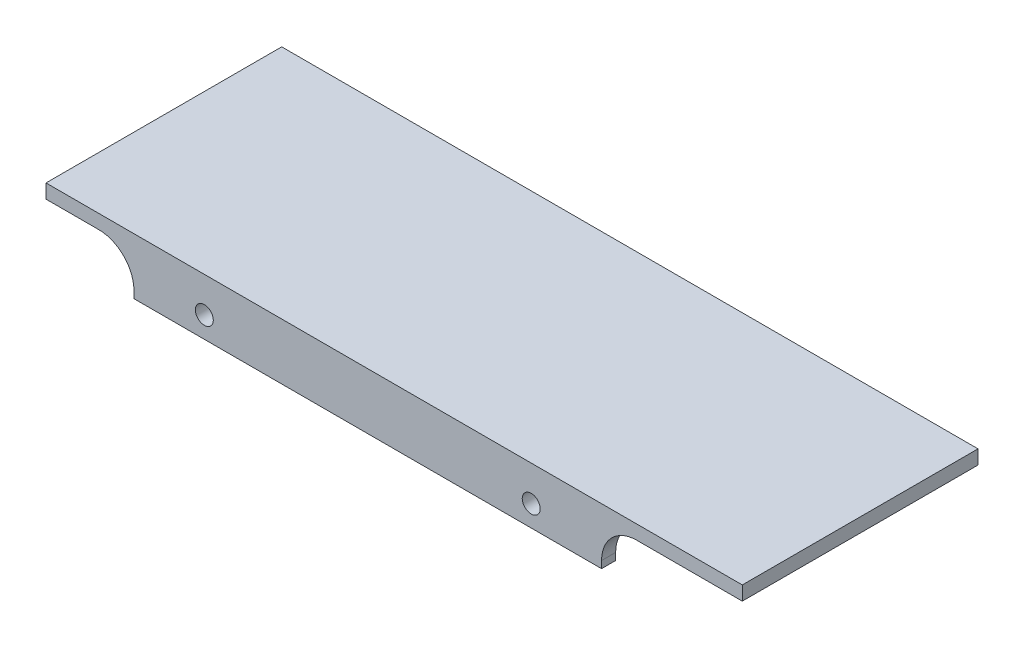
ISO-10303-21;
HEADER;
FILE_DESCRIPTION(('STEP AP214'),'2;1');
FILE_NAME('part.step','',(''),(''),'','','');
FILE_SCHEMA(('AUTOMOTIVE_DESIGN { 1 0 10303 214 1 1 1 1 }'));
ENDSEC;
DATA;
#1=APPLICATION_CONTEXT('core data for automotive mechanical design processes');
#2=APPLICATION_PROTOCOL_DEFINITION('international standard','automotive_design',2000,#1);
#3=PRODUCT_CONTEXT('',#1,'mechanical');
#4=PRODUCT('Part','Part','',(#3));
#5=PRODUCT_RELATED_PRODUCT_CATEGORY('part','',(#4));
#6=PRODUCT_DEFINITION_FORMATION('','',#4);
#7=PRODUCT_DEFINITION_CONTEXT('part definition',#1,'design');
#8=PRODUCT_DEFINITION('design','',#6,#7);
#9=PRODUCT_DEFINITION_SHAPE('','',#8);
#10=(LENGTH_UNIT() NAMED_UNIT(*) SI_UNIT(.MILLI.,.METRE.));
#11=(NAMED_UNIT(*) PLANE_ANGLE_UNIT() SI_UNIT($,.RADIAN.));
#12=(NAMED_UNIT(*) SI_UNIT($,.STERADIAN.) SOLID_ANGLE_UNIT());
#13=UNCERTAINTY_MEASURE_WITH_UNIT(LENGTH_MEASURE(1.E-05),#10,'distance_accuracy_value','');
#14=(GEOMETRIC_REPRESENTATION_CONTEXT(3) GLOBAL_UNCERTAINTY_ASSIGNED_CONTEXT((#13)) GLOBAL_UNIT_ASSIGNED_CONTEXT((#10,
#11,#12)) REPRESENTATION_CONTEXT('',''));
#15=CARTESIAN_POINT('',(0.,0.,0.));
#16=DIRECTION('',(0.,0.,1.));
#17=DIRECTION('',(1.,0.,0.));
#18=AXIS2_PLACEMENT_3D('',#15,#16,#17);
#19=CARTESIAN_POINT('',(-1.60418411700392E-13,55.7999999999995,0.));
#20=DIRECTION('',(0.,1.,0.));
#21=DIRECTION('',(-1.,0.,0.));
#22=AXIS2_PLACEMENT_3D('',#19,#20,#21);
#23=PLANE('',#22);
#24=DIRECTION('',(0.,0.,1.));
#25=VECTOR('',#24,1.);
#26=CARTESIAN_POINT('',(-40.,55.7999999999994,62.9999999999997));
#27=LINE('',#26,#25);
#28=CARTESIAN_POINT('',(-40.,55.7999999999994,66.9999999999997));
#29=VERTEX_POINT('',#28);
#30=CARTESIAN_POINT('',(-40.,55.7999999999994,60.4999999999997));
#31=VERTEX_POINT('',#30);
#32=EDGE_CURVE('E274',#29,#31,#27,.F.);
#33=ORIENTED_EDGE('',*,*,#32,.T.);
#34=DIRECTION('',(1.,0.,0.));
#35=VECTOR('',#34,1.);
#36=CARTESIAN_POINT('',(-1.60418411700392E-13,55.7999999999995,60.4999999999997));
#37=LINE('',#36,#35);
#38=CARTESIAN_POINT('',(-192.917449812531,55.7999999999989,60.4999999999997));
#39=VERTEX_POINT('',#38);
#40=EDGE_CURVE('E310',#31,#39,#37,.F.);
#41=ORIENTED_EDGE('',*,*,#40,.T.);
#42=DIRECTION('',(0.,0.,1.));
#43=VECTOR('',#42,1.);
#44=CARTESIAN_POINT('',(-192.917449812531,55.7999999999989,66.9999999999997));
#45=LINE('',#44,#43);
#46=CARTESIAN_POINT('',(-192.917449812531,55.7999999999989,66.9999999999997));
#47=VERTEX_POINT('',#46);
#48=EDGE_CURVE('E279',#39,#47,#45,.T.);
#49=ORIENTED_EDGE('',*,*,#48,.T.);
#50=DIRECTION('',(1.,0.,0.));
#51=VECTOR('',#50,1.);
#52=CARTESIAN_POINT('',(-207.917449812527,55.7999999999989,66.9999999999997));
#53=LINE('',#52,#51);
#54=CARTESIAN_POINT('',(-207.917449812527,55.7999999999989,66.9999999999997));
#55=VERTEX_POINT('',#54);
#56=EDGE_CURVE('E220',#55,#47,#53,.T.);
#57=ORIENTED_EDGE('',*,*,#56,.F.);
#58=DIRECTION('',(0.,0.,1.));
#59=VECTOR('',#58,1.);
#60=CARTESIAN_POINT('',(-207.917449812527,55.7999999999989,0.));
#61=LINE('',#60,#59);
#62=CARTESIAN_POINT('',(-207.917449812527,55.7999999999989,0.));
#63=VERTEX_POINT('',#62);
#64=EDGE_CURVE('E188',#63,#55,#61,.T.);
#65=ORIENTED_EDGE('',*,*,#64,.F.);
#66=DIRECTION('',(-1.,0.,0.));
#67=VECTOR('',#66,1.);
#68=CARTESIAN_POINT('',(-207.917449812527,55.7999999999989,0.));
#69=LINE('',#68,#67);
#70=CARTESIAN_POINT('',(-192.917449812531,55.7999999999989,0.));
#71=VERTEX_POINT('',#70);
#72=EDGE_CURVE('E225',#71,#63,#69,.T.);
#73=ORIENTED_EDGE('',*,*,#72,.F.);
#74=DIRECTION('',(0.,0.,-1.));
#75=VECTOR('',#74,1.);
#76=CARTESIAN_POINT('',(-192.917449812531,55.7999999999989,4.));
#77=LINE('',#76,#75);
#78=CARTESIAN_POINT('',(-192.917449812531,55.7999999999989,6.5));
#79=VERTEX_POINT('',#78);
#80=EDGE_CURVE('E282',#71,#79,#77,.F.);
#81=ORIENTED_EDGE('',*,*,#80,.T.);
#82=DIRECTION('',(-1.,0.,0.));
#83=VECTOR('',#82,1.);
#84=CARTESIAN_POINT('',(-1.60418411700392E-13,55.7999999999995,6.5));
#85=LINE('',#84,#83);
#86=CARTESIAN_POINT('',(-40.,55.7999999999994,6.5));
#87=VERTEX_POINT('',#86);
#88=EDGE_CURVE('E307',#79,#87,#85,.F.);
#89=ORIENTED_EDGE('',*,*,#88,.T.);
#90=DIRECTION('',(0.,0.,-1.));
#91=VECTOR('',#90,1.);
#92=CARTESIAN_POINT('',(-40.,55.7999999999994,0.));
#93=LINE('',#92,#91);
#94=CARTESIAN_POINT('',(-40.,55.7999999999994,0.));
#95=VERTEX_POINT('',#94);
#96=EDGE_CURVE('E276',#87,#95,#93,.T.);
#97=ORIENTED_EDGE('',*,*,#96,.T.);
#98=CARTESIAN_POINT('',(-9.99999999999982,55.7999999999995,0.));
#99=VERTEX_POINT('',#98);
#100=EDGE_CURVE('E210',#99,#95,#69,.T.);
#101=ORIENTED_EDGE('',*,*,#100,.F.);
#102=DIRECTION('',(0.,0.,-1.));
#103=VECTOR('',#102,1.);
#104=CARTESIAN_POINT('',(-9.99999999999982,55.7999999999995,0.));
#105=LINE('',#104,#103);
#106=CARTESIAN_POINT('',(-9.99999999999984,55.7999999999995,66.9999999999997));
#107=VERTEX_POINT('',#106);
#108=EDGE_CURVE('E223',#107,#99,#105,.T.);
#109=ORIENTED_EDGE('',*,*,#108,.F.);
#110=EDGE_CURVE('E219',#29,#107,#53,.T.);
#111=ORIENTED_EDGE('',*,*,#110,.F.);
#112=EDGE_LOOP('',(#33,#41,#49,#57,#65,#73,#81,#89,#97,#101,#109,#111));
#113=FACE_BOUND('',#112,.T.);
#114=ADVANCED_FACE('F34',(#113),#23,.F.);
#115=CARTESIAN_POINT('',(0.,0.,4.));
#116=DIRECTION('',(0.,0.,1.));
#117=DIRECTION('',(1.,0.,0.));
#118=AXIS2_PLACEMENT_3D('',#115,#116,#117);
#119=PLANE('',#118);
#120=CARTESIAN_POINT('',(-162.917449812531,49.7999999999995,4.));
#121=DIRECTION('',(0.,0.,1.));
#122=DIRECTION('',(1.,0.,0.));
#123=AXIS2_PLACEMENT_3D('',#120,#121,#122);
#124=CIRCLE('',#123,2.54999999999999);
#125=CARTESIAN_POINT('',(-160.367449812531,49.7999999999995,4.));
#126=VERTEX_POINT('',#125);
#127=EDGE_CURVE('E246',#126,#126,#124,.T.);
#128=ORIENTED_EDGE('',*,*,#127,.F.);
#129=EDGE_LOOP('',(#128));
#130=FACE_BOUND('',#129,.T.);
#131=CARTESIAN_POINT('',(-39.9999999999999,45.7999999999994,4.));
#132=DIRECTION('',(0.,0.,1.));
#133=DIRECTION('',(1.,0.,0.));
#134=AXIS2_PLACEMENT_3D('',#131,#132,#133);
#135=CIRCLE('',#134,10.);
#136=CARTESIAN_POINT('',(-49.9999999999999,45.7999999999994,4.));
#137=VERTEX_POINT('',#136);
#138=CARTESIAN_POINT('',(-46.6143782776614,53.2999999999994,4.));
#139=VERTEX_POINT('',#138);
#140=EDGE_CURVE('E300',#137,#139,#135,.F.);
#141=ORIENTED_EDGE('',*,*,#140,.T.);
#142=DIRECTION('',(-1.,0.,0.));
#143=VECTOR('',#142,1.);
#144=CARTESIAN_POINT('',(-1.53231206875105E-13,53.2999999999995,4.));
#145=LINE('',#144,#143);
#146=CARTESIAN_POINT('',(-186.303071534869,53.299999999999,4.));
#147=VERTEX_POINT('',#146);
#148=EDGE_CURVE('E313',#139,#147,#145,.T.);
#149=ORIENTED_EDGE('',*,*,#148,.T.);
#150=CARTESIAN_POINT('',(-192.917449812531,45.7999999999989,4.));
#151=DIRECTION('',(0.,0.,1.));
#152=DIRECTION('',(1.,0.,0.));
#153=AXIS2_PLACEMENT_3D('',#150,#151,#152);
#154=CIRCLE('',#153,10.);
#155=CARTESIAN_POINT('',(-182.917449812531,45.7999999999989,4.));
#156=VERTEX_POINT('',#155);
#157=EDGE_CURVE('E292',#147,#156,#154,.F.);
#158=ORIENTED_EDGE('',*,*,#157,.T.);
#159=DIRECTION('',(0.,-1.,0.));
#160=VECTOR('',#159,1.);
#161=CARTESIAN_POINT('',(-182.917449812531,55.7999999999995,4.));
#162=LINE('',#161,#160);
#163=CARTESIAN_POINT('',(-182.917449812531,43.7999999999995,4.));
#164=VERTEX_POINT('',#163);
#165=EDGE_CURVE('E252',#156,#164,#162,.T.);
#166=ORIENTED_EDGE('',*,*,#165,.T.);
#167=DIRECTION('',(1.,0.,0.));
#168=VECTOR('',#167,1.);
#169=CARTESIAN_POINT('',(-182.917449812531,43.7999999999995,4.));
#170=LINE('',#169,#168);
#171=CARTESIAN_POINT('',(-49.9999999999999,43.7999999999995,4.));
#172=VERTEX_POINT('',#171);
#173=EDGE_CURVE('E254',#164,#172,#170,.T.);
#174=ORIENTED_EDGE('',*,*,#173,.T.);
#175=DIRECTION('',(0.,1.,0.));
#176=VECTOR('',#175,1.);
#177=CARTESIAN_POINT('',(-49.9999999999999,55.7999999999995,4.));
#178=LINE('',#177,#176);
#179=EDGE_CURVE('E257',#172,#137,#178,.T.);
#180=ORIENTED_EDGE('',*,*,#179,.T.);
#181=EDGE_LOOP('',(#141,#149,#158,#166,#174,#180));
#182=FACE_BOUND('',#181,.T.);
#183=CARTESIAN_POINT('',(-69.9999999999999,49.7999999999995,4.));
#184=DIRECTION('',(0.,0.,1.));
#185=DIRECTION('',(1.,0.,0.));
#186=AXIS2_PLACEMENT_3D('',#183,#184,#185);
#187=CIRCLE('',#186,2.54999999999999);
#188=CARTESIAN_POINT('',(-67.4499999999999,49.7999999999995,4.));
#189=VERTEX_POINT('',#188);
#190=EDGE_CURVE('E240',#189,#189,#187,.T.);
#191=ORIENTED_EDGE('',*,*,#190,.F.);
#192=EDGE_LOOP('',(#191));
#193=FACE_BOUND('',#192,.T.);
#194=ADVANCED_FACE('F344',(#130,#182,#193),#119,.T.);
#195=CARTESIAN_POINT('',(0.,0.,0.));
#196=DIRECTION('',(0.,0.,1.));
#197=DIRECTION('',(1.,0.,0.));
#198=AXIS2_PLACEMENT_3D('',#195,#196,#197);
#199=PLANE('',#198);
#200=DIRECTION('',(0.,-1.,0.));
#201=VECTOR('',#200,1.);
#202=CARTESIAN_POINT('',(-182.917449812531,55.7999999999995,0.));
#203=LINE('',#202,#201);
#204=CARTESIAN_POINT('',(-182.917449812531,45.7999999999989,0.));
#205=VERTEX_POINT('',#204);
#206=CARTESIAN_POINT('',(-182.917449812531,43.7999999999995,0.));
#207=VERTEX_POINT('',#206);
#208=EDGE_CURVE('E249',#205,#207,#203,.T.);
#209=ORIENTED_EDGE('',*,*,#208,.F.);
#210=CARTESIAN_POINT('',(-192.917449812531,45.7999999999989,0.));
#211=DIRECTION('',(0.,0.,1.));
#212=DIRECTION('',(1.,0.,0.));
#213=AXIS2_PLACEMENT_3D('',#210,#211,#212);
#214=CIRCLE('',#213,10.);
#215=EDGE_CURVE('E290',#205,#71,#214,.T.);
#216=ORIENTED_EDGE('',*,*,#215,.T.);
#217=ORIENTED_EDGE('',*,*,#72,.T.);
#218=DIRECTION('',(0.,-1.,0.));
#219=VECTOR('',#218,1.);
#220=CARTESIAN_POINT('',(-207.917449812527,59.7999999999989,0.));
#221=LINE('',#220,#219);
#222=CARTESIAN_POINT('',(-207.917449812527,59.7999999999989,0.));
#223=VERTEX_POINT('',#222);
#224=EDGE_CURVE('E216',#223,#63,#221,.T.);
#225=ORIENTED_EDGE('',*,*,#224,.F.);
#226=DIRECTION('',(-1.,0.,0.));
#227=VECTOR('',#226,1.);
#228=CARTESIAN_POINT('',(-207.917449812527,59.7999999999989,0.));
#229=LINE('',#228,#227);
#230=CARTESIAN_POINT('',(-9.99999999999983,59.7999999999995,0.));
#231=VERTEX_POINT('',#230);
#232=EDGE_CURVE('E214',#231,#223,#229,.T.);
#233=ORIENTED_EDGE('',*,*,#232,.F.);
#234=DIRECTION('',(0.,-1.,0.));
#235=VECTOR('',#234,1.);
#236=CARTESIAN_POINT('',(-9.99999999999983,59.7999999999995,0.));
#237=LINE('',#236,#235);
#238=EDGE_CURVE('E230',#231,#99,#237,.T.);
#239=ORIENTED_EDGE('',*,*,#238,.T.);
#240=ORIENTED_EDGE('',*,*,#100,.T.);
#241=CARTESIAN_POINT('',(-39.9999999999999,45.7999999999994,0.));
#242=DIRECTION('',(0.,0.,1.));
#243=DIRECTION('',(1.,0.,0.));
#244=AXIS2_PLACEMENT_3D('',#241,#242,#243);
#245=CIRCLE('',#244,10.);
#246=CARTESIAN_POINT('',(-49.9999999999999,45.7999999999994,0.));
#247=VERTEX_POINT('',#246);
#248=EDGE_CURVE('E298',#95,#247,#245,.T.);
#249=ORIENTED_EDGE('',*,*,#248,.T.);
#250=DIRECTION('',(0.,1.,0.));
#251=VECTOR('',#250,1.);
#252=CARTESIAN_POINT('',(-49.9999999999999,55.7999999999995,0.));
#253=LINE('',#252,#251);
#254=CARTESIAN_POINT('',(-49.9999999999999,43.7999999999995,0.));
#255=VERTEX_POINT('',#254);
#256=EDGE_CURVE('E255',#255,#247,#253,.T.);
#257=ORIENTED_EDGE('',*,*,#256,.F.);
#258=DIRECTION('',(1.,0.,0.));
#259=VECTOR('',#258,1.);
#260=CARTESIAN_POINT('',(-182.917449812531,43.7999999999995,0.));
#261=LINE('',#260,#259);
#262=EDGE_CURVE('E262',#207,#255,#261,.T.);
#263=ORIENTED_EDGE('',*,*,#262,.F.);
#264=EDGE_LOOP('',(#209,#216,#217,#225,#233,#239,#240,#249,#257,#263));
#265=FACE_BOUND('',#264,.T.);
#266=CARTESIAN_POINT('',(-162.917449812531,49.7999999999995,0.));
#267=DIRECTION('',(0.,0.,1.));
#268=DIRECTION('',(1.,0.,0.));
#269=AXIS2_PLACEMENT_3D('',#266,#267,#268);
#270=CIRCLE('',#269,2.54999999999999);
#271=CARTESIAN_POINT('',(-160.367449812531,49.7999999999995,0.));
#272=VERTEX_POINT('',#271);
#273=EDGE_CURVE('E243',#272,#272,#270,.T.);
#274=ORIENTED_EDGE('',*,*,#273,.T.);
#275=EDGE_LOOP('',(#274));
#276=FACE_BOUND('',#275,.T.);
#277=CARTESIAN_POINT('',(-69.9999999999999,49.7999999999995,0.));
#278=DIRECTION('',(0.,0.,1.));
#279=DIRECTION('',(1.,0.,0.));
#280=AXIS2_PLACEMENT_3D('',#277,#278,#279);
#281=CIRCLE('',#280,2.54999999999999);
#282=CARTESIAN_POINT('',(-67.4499999999999,49.7999999999995,0.));
#283=VERTEX_POINT('',#282);
#284=EDGE_CURVE('E239',#283,#283,#281,.T.);
#285=ORIENTED_EDGE('',*,*,#284,.T.);
#286=EDGE_LOOP('',(#285));
#287=FACE_BOUND('',#286,.T.);
#288=ADVANCED_FACE('F350',(#265,#276,#287),#199,.F.);
#289=CARTESIAN_POINT('',(-182.917449812531,55.7999999999995,4.));
#290=DIRECTION('',(1.,0.,0.));
#291=DIRECTION('',(0.,0.,-1.));
#292=AXIS2_PLACEMENT_3D('',#289,#290,#291);
#293=PLANE('',#292);
#294=ORIENTED_EDGE('',*,*,#165,.F.);
#295=DIRECTION('',(0.,0.,-1.));
#296=VECTOR('',#295,1.);
#297=CARTESIAN_POINT('',(-182.917449812531,45.7999999999989,0.));
#298=LINE('',#297,#296);
#299=EDGE_CURVE('E271',#156,#205,#298,.T.);
#300=ORIENTED_EDGE('',*,*,#299,.T.);
#301=ORIENTED_EDGE('',*,*,#208,.T.);
#302=DIRECTION('',(0.,0.,-1.));
#303=VECTOR('',#302,1.);
#304=CARTESIAN_POINT('',(-182.917449812531,43.7999999999995,4.));
#305=LINE('',#304,#303);
#306=EDGE_CURVE('E268',#164,#207,#305,.T.);
#307=ORIENTED_EDGE('',*,*,#306,.F.);
#308=EDGE_LOOP('',(#294,#300,#301,#307));
#309=FACE_BOUND('',#308,.T.);
#310=ADVANCED_FACE('F380',(#309),#293,.F.);
#311=CARTESIAN_POINT('',(-182.917449812531,43.7999999999995,4.));
#312=DIRECTION('',(0.,1.,0.));
#313=DIRECTION('',(0.,0.,1.));
#314=AXIS2_PLACEMENT_3D('',#311,#312,#313);
#315=PLANE('',#314);
#316=ORIENTED_EDGE('',*,*,#262,.T.);
#317=DIRECTION('',(0.,0.,-1.));
#318=VECTOR('',#317,1.);
#319=CARTESIAN_POINT('',(-49.9999999999999,43.7999999999995,4.));
#320=LINE('',#319,#318);
#321=EDGE_CURVE('E260',#172,#255,#320,.T.);
#322=ORIENTED_EDGE('',*,*,#321,.F.);
#323=ORIENTED_EDGE('',*,*,#173,.F.);
#324=ORIENTED_EDGE('',*,*,#306,.T.);
#325=EDGE_LOOP('',(#316,#322,#323,#324));
#326=FACE_BOUND('',#325,.T.);
#327=ADVANCED_FACE('F384',(#326),#315,.F.);
#328=CARTESIAN_POINT('',(-49.9999999999999,55.7999999999995,4.));
#329=DIRECTION('',(-1.,0.,0.));
#330=DIRECTION('',(0.,0.,1.));
#331=AXIS2_PLACEMENT_3D('',#328,#329,#330);
#332=PLANE('',#331);
#333=ORIENTED_EDGE('',*,*,#256,.T.);
#334=DIRECTION('',(0.,0.,-1.));
#335=VECTOR('',#334,1.);
#336=CARTESIAN_POINT('',(-49.9999999999999,45.7999999999994,4.));
#337=LINE('',#336,#335);
#338=EDGE_CURVE('E286',#247,#137,#337,.F.);
#339=ORIENTED_EDGE('',*,*,#338,.T.);
#340=ORIENTED_EDGE('',*,*,#179,.F.);
#341=ORIENTED_EDGE('',*,*,#321,.T.);
#342=EDGE_LOOP('',(#333,#339,#340,#341));
#343=FACE_BOUND('',#342,.T.);
#344=ADVANCED_FACE('F375',(#343),#332,.F.);
#345=CARTESIAN_POINT('',(-162.917449812531,49.7999999999995,4.));
#346=DIRECTION('',(0.,0.,-1.));
#347=DIRECTION('',(-1.,0.,0.));
#348=AXIS2_PLACEMENT_3D('',#345,#346,#347);
#349=CYLINDRICAL_SURFACE('',#348,2.54999999999999);
#350=ORIENTED_EDGE('',*,*,#127,.T.);
#351=EDGE_LOOP('',(#350));
#352=FACE_BOUND('',#351,.T.);
#353=ORIENTED_EDGE('',*,*,#273,.F.);
#354=EDGE_LOOP('',(#353));
#355=FACE_BOUND('',#354,.T.);
#356=ADVANCED_FACE('F372',(#352,#355),#349,.F.);
#357=CARTESIAN_POINT('',(-69.9999999999999,49.7999999999995,4.));
#358=DIRECTION('',(0.,0.,-1.));
#359=DIRECTION('',(-1.,0.,0.));
#360=AXIS2_PLACEMENT_3D('',#357,#358,#359);
#361=CYLINDRICAL_SURFACE('',#360,2.54999999999999);
#362=ORIENTED_EDGE('',*,*,#190,.T.);
#363=EDGE_LOOP('',(#362));
#364=FACE_BOUND('',#363,.T.);
#365=ORIENTED_EDGE('',*,*,#284,.F.);
#366=EDGE_LOOP('',(#365));
#367=FACE_BOUND('',#366,.T.);
#368=ADVANCED_FACE('F368',(#364,#367),#361,.F.);
#369=CARTESIAN_POINT('',(-207.917449812527,59.7999999999989,0.));
#370=DIRECTION('',(1.,0.,0.));
#371=DIRECTION('',(0.,1.,0.));
#372=AXIS2_PLACEMENT_3D('',#369,#370,#371);
#373=PLANE('',#372);
#374=ORIENTED_EDGE('',*,*,#64,.T.);
#375=DIRECTION('',(0.,-1.,0.));
#376=VECTOR('',#375,1.);
#377=CARTESIAN_POINT('',(-207.917449812527,59.7999999999989,66.9999999999997));
#378=LINE('',#377,#376);
#379=CARTESIAN_POINT('',(-207.917449812527,59.7999999999989,66.9999999999997));
#380=VERTEX_POINT('',#379);
#381=EDGE_CURVE('E236',#380,#55,#378,.T.);
#382=ORIENTED_EDGE('',*,*,#381,.F.);
#383=DIRECTION('',(0.,0.,1.));
#384=VECTOR('',#383,1.);
#385=CARTESIAN_POINT('',(-207.917449812527,59.7999999999989,0.));
#386=LINE('',#385,#384);
#387=EDGE_CURVE('E206',#223,#380,#386,.T.);
#388=ORIENTED_EDGE('',*,*,#387,.F.);
#389=ORIENTED_EDGE('',*,*,#224,.T.);
#390=EDGE_LOOP('',(#374,#382,#388,#389));
#391=FACE_BOUND('',#390,.T.);
#392=ADVANCED_FACE('F364',(#391),#373,.F.);
#393=CARTESIAN_POINT('',(-207.917449812527,59.7999999999989,66.9999999999997));
#394=DIRECTION('',(0.,0.,-1.));
#395=DIRECTION('',(-1.,0.,0.));
#396=AXIS2_PLACEMENT_3D('',#393,#394,#395);
#397=PLANE('',#396);
#398=ORIENTED_EDGE('',*,*,#56,.T.);
#399=CARTESIAN_POINT('',(-192.917449812531,45.7999999999989,66.9999999999997));
#400=DIRECTION('',(0.,0.,-1.));
#401=DIRECTION('',(-1.,0.,0.));
#402=AXIS2_PLACEMENT_3D('',#399,#400,#401);
#403=CIRCLE('',#402,10.);
#404=CARTESIAN_POINT('',(-182.917449812531,45.7999999999989,66.9999999999997));
#405=VERTEX_POINT('',#404);
#406=EDGE_CURVE('E294',#47,#405,#403,.T.);
#407=ORIENTED_EDGE('',*,*,#406,.T.);
#408=DIRECTION('',(0.,1.,0.));
#409=VECTOR('',#408,1.);
#410=CARTESIAN_POINT('',(-182.917449812531,43.7999999999995,66.9999999999997));
#411=LINE('',#410,#409);
#412=CARTESIAN_POINT('',(-182.917449812531,43.7999999999995,66.9999999999997));
#413=VERTEX_POINT('',#412);
#414=EDGE_CURVE('E179',#413,#405,#411,.T.);
#415=ORIENTED_EDGE('',*,*,#414,.F.);
#416=DIRECTION('',(-1.,0.,0.));
#417=VECTOR('',#416,1.);
#418=CARTESIAN_POINT('',(-49.9999999999999,43.7999999999995,66.9999999999997));
#419=LINE('',#418,#417);
#420=CARTESIAN_POINT('',(-49.9999999999999,43.7999999999995,66.9999999999997));
#421=VERTEX_POINT('',#420);
#422=EDGE_CURVE('E200',#421,#413,#419,.T.);
#423=ORIENTED_EDGE('',*,*,#422,.F.);
#424=DIRECTION('',(0.,-1.,0.));
#425=VECTOR('',#424,1.);
#426=CARTESIAN_POINT('',(-49.9999999999999,55.7999999999995,66.9999999999997));
#427=LINE('',#426,#425);
#428=CARTESIAN_POINT('',(-49.9999999999999,45.7999999999994,66.9999999999997));
#429=VERTEX_POINT('',#428);
#430=EDGE_CURVE('E185',#429,#421,#427,.T.);
#431=ORIENTED_EDGE('',*,*,#430,.F.);
#432=CARTESIAN_POINT('',(-39.9999999999999,45.7999999999994,66.9999999999997));
#433=DIRECTION('',(0.,0.,-1.));
#434=DIRECTION('',(-1.,0.,0.));
#435=AXIS2_PLACEMENT_3D('',#432,#433,#434);
#436=CIRCLE('',#435,10.);
#437=EDGE_CURVE('E302',#429,#29,#436,.T.);
#438=ORIENTED_EDGE('',*,*,#437,.T.);
#439=ORIENTED_EDGE('',*,*,#110,.T.);
#440=DIRECTION('',(0.,-1.,0.));
#441=VECTOR('',#440,1.);
#442=CARTESIAN_POINT('',(-9.99999999999985,59.7999999999995,66.9999999999997));
#443=LINE('',#442,#441);
#444=CARTESIAN_POINT('',(-9.99999999999985,59.7999999999995,66.9999999999997));
#445=VERTEX_POINT('',#444);
#446=EDGE_CURVE('E233',#445,#107,#443,.T.);
#447=ORIENTED_EDGE('',*,*,#446,.F.);
#448=DIRECTION('',(1.,0.,0.));
#449=VECTOR('',#448,1.);
#450=CARTESIAN_POINT('',(-207.917449812527,59.7999999999989,66.9999999999997));
#451=LINE('',#450,#449);
#452=EDGE_CURVE('E209',#380,#445,#451,.T.);
#453=ORIENTED_EDGE('',*,*,#452,.F.);
#454=ORIENTED_EDGE('',*,*,#381,.T.);
#455=EDGE_LOOP('',(#398,#407,#415,#423,#431,#438,#439,#447,#453,#454));
#456=FACE_BOUND('',#455,.T.);
#457=CARTESIAN_POINT('',(-162.917449812531,49.7999999999995,66.9999999999997));
#458=DIRECTION('',(0.,0.,-1.));
#459=DIRECTION('',(-1.,0.,0.));
#460=AXIS2_PLACEMENT_3D('',#457,#458,#459);
#461=CIRCLE('',#460,2.54999999999999);
#462=CARTESIAN_POINT('',(-165.467449812531,49.7999999999995,66.9999999999997));
#463=VERTEX_POINT('',#462);
#464=EDGE_CURVE('E616',#463,#463,#461,.T.);
#465=ORIENTED_EDGE('',*,*,#464,.T.);
#466=EDGE_LOOP('',(#465));
#467=FACE_BOUND('',#466,.T.);
#468=CARTESIAN_POINT('',(-69.9999999999999,49.7999999999995,66.9999999999997));
#469=DIRECTION('',(0.,0.,-1.));
#470=DIRECTION('',(-1.,0.,0.));
#471=AXIS2_PLACEMENT_3D('',#468,#469,#470);
#472=CIRCLE('',#471,2.54999999999999);
#473=CARTESIAN_POINT('',(-72.5499999999999,49.7999999999995,66.9999999999997));
#474=VERTEX_POINT('',#473);
#475=EDGE_CURVE('E613',#474,#474,#472,.T.);
#476=ORIENTED_EDGE('',*,*,#475,.T.);
#477=EDGE_LOOP('',(#476));
#478=FACE_BOUND('',#477,.T.);
#479=ADVANCED_FACE('F360',(#456,#467,#478),#397,.F.);
#480=CARTESIAN_POINT('',(-9.99999999999983,59.7999999999995,0.));
#481=DIRECTION('',(-1.,0.,0.));
#482=DIRECTION('',(0.,-1.,0.));
#483=AXIS2_PLACEMENT_3D('',#480,#481,#482);
#484=PLANE('',#483);
#485=ORIENTED_EDGE('',*,*,#108,.T.);
#486=ORIENTED_EDGE('',*,*,#238,.F.);
#487=DIRECTION('',(0.,0.,-1.));
#488=VECTOR('',#487,1.);
#489=CARTESIAN_POINT('',(-9.99999999999983,59.7999999999995,0.));
#490=LINE('',#489,#488);
#491=EDGE_CURVE('E212',#445,#231,#490,.T.);
#492=ORIENTED_EDGE('',*,*,#491,.F.);
#493=ORIENTED_EDGE('',*,*,#446,.T.);
#494=EDGE_LOOP('',(#485,#486,#492,#493));
#495=FACE_BOUND('',#494,.T.);
#496=ADVANCED_FACE('F357',(#495),#484,.F.);
#497=CARTESIAN_POINT('',(-1.71903409802693E-13,59.7999999999995,0.));
#498=DIRECTION('',(0.,1.,0.));
#499=DIRECTION('',(-1.,0.,0.));
#500=AXIS2_PLACEMENT_3D('',#497,#498,#499);
#501=PLANE('',#500);
#502=ORIENTED_EDGE('',*,*,#387,.T.);
#503=ORIENTED_EDGE('',*,*,#452,.T.);
#504=ORIENTED_EDGE('',*,*,#491,.T.);
#505=ORIENTED_EDGE('',*,*,#232,.T.);
#506=EDGE_LOOP('',(#502,#503,#504,#505));
#507=FACE_BOUND('',#506,.T.);
#508=ADVANCED_FACE('F355',(#507),#501,.T.);
#509=CARTESIAN_POINT('',(0.,0.,62.9999999999997));
#510=DIRECTION('',(0.,0.,-1.));
#511=DIRECTION('',(-1.,0.,0.));
#512=AXIS2_PLACEMENT_3D('',#509,#510,#511);
#513=PLANE('',#512);
#514=CARTESIAN_POINT('',(-162.917449812531,49.7999999999995,62.9999999999997));
#515=DIRECTION('',(0.,0.,-1.));
#516=DIRECTION('',(-1.,0.,0.));
#517=AXIS2_PLACEMENT_3D('',#514,#515,#516);
#518=CIRCLE('',#517,2.54999999999999);
#519=CARTESIAN_POINT('',(-165.467449812531,49.7999999999995,62.9999999999997));
#520=VERTEX_POINT('',#519);
#521=EDGE_CURVE('E201',#520,#520,#518,.T.);
#522=ORIENTED_EDGE('',*,*,#521,.F.);
#523=EDGE_LOOP('',(#522));
#524=FACE_BOUND('',#523,.T.);
#525=CARTESIAN_POINT('',(-192.917449812531,45.7999999999989,62.9999999999997));
#526=DIRECTION('',(0.,0.,-1.));
#527=DIRECTION('',(-1.,0.,0.));
#528=AXIS2_PLACEMENT_3D('',#525,#526,#527);
#529=CIRCLE('',#528,10.);
#530=CARTESIAN_POINT('',(-182.917449812531,45.7999999999989,62.9999999999997));
#531=VERTEX_POINT('',#530);
#532=CARTESIAN_POINT('',(-186.303071534869,53.299999999999,62.9999999999997));
#533=VERTEX_POINT('',#532);
#534=EDGE_CURVE('E296',#531,#533,#529,.F.);
#535=ORIENTED_EDGE('',*,*,#534,.T.);
#536=DIRECTION('',(1.,0.,0.));
#537=VECTOR('',#536,1.);
#538=CARTESIAN_POINT('',(-1.53231206875105E-13,53.2999999999995,62.9999999999997));
#539=LINE('',#538,#537);
#540=CARTESIAN_POINT('',(-46.6143782776614,53.2999999999994,62.9999999999997));
#541=VERTEX_POINT('',#540);
#542=EDGE_CURVE('E305',#533,#541,#539,.T.);
#543=ORIENTED_EDGE('',*,*,#542,.T.);
#544=CARTESIAN_POINT('',(-39.9999999999999,45.7999999999994,62.9999999999997));
#545=DIRECTION('',(0.,0.,-1.));
#546=DIRECTION('',(-1.,0.,0.));
#547=AXIS2_PLACEMENT_3D('',#544,#545,#546);
#548=CIRCLE('',#547,10.);
#549=CARTESIAN_POINT('',(-49.9999999999999,45.7999999999994,62.9999999999997));
#550=VERTEX_POINT('',#549);
#551=EDGE_CURVE('E175',#541,#550,#548,.F.);
#552=ORIENTED_EDGE('',*,*,#551,.T.);
#553=DIRECTION('',(0.,-1.,0.));
#554=VECTOR('',#553,1.);
#555=CARTESIAN_POINT('',(-49.9999999999999,55.7999999999995,62.9999999999997));
#556=LINE('',#555,#554);
#557=CARTESIAN_POINT('',(-49.9999999999999,43.7999999999995,62.9999999999997));
#558=VERTEX_POINT('',#557);
#559=EDGE_CURVE('E164',#550,#558,#556,.T.);
#560=ORIENTED_EDGE('',*,*,#559,.T.);
#561=DIRECTION('',(-1.,0.,0.));
#562=VECTOR('',#561,1.);
#563=CARTESIAN_POINT('',(-49.9999999999999,43.7999999999995,62.9999999999997));
#564=LINE('',#563,#562);
#565=CARTESIAN_POINT('',(-182.917449812531,43.7999999999995,62.9999999999997));
#566=VERTEX_POINT('',#565);
#567=EDGE_CURVE('E171',#558,#566,#564,.T.);
#568=ORIENTED_EDGE('',*,*,#567,.T.);
#569=DIRECTION('',(0.,1.,0.));
#570=VECTOR('',#569,1.);
#571=CARTESIAN_POINT('',(-182.917449812531,43.7999999999995,62.9999999999997));
#572=LINE('',#571,#570);
#573=EDGE_CURVE('E194',#566,#531,#572,.T.);
#574=ORIENTED_EDGE('',*,*,#573,.T.);
#575=EDGE_LOOP('',(#535,#543,#552,#560,#568,#574));
#576=FACE_BOUND('',#575,.T.);
#577=CARTESIAN_POINT('',(-69.9999999999999,49.7999999999995,62.9999999999997));
#578=DIRECTION('',(0.,0.,-1.));
#579=DIRECTION('',(-1.,0.,0.));
#580=AXIS2_PLACEMENT_3D('',#577,#578,#579);
#581=CIRCLE('',#580,2.54999999999999);
#582=CARTESIAN_POINT('',(-72.5499999999999,49.7999999999995,62.9999999999997));
#583=VERTEX_POINT('',#582);
#584=EDGE_CURVE('E610',#583,#583,#581,.T.);
#585=ORIENTED_EDGE('',*,*,#584,.F.);
#586=EDGE_LOOP('',(#585));
#587=FACE_BOUND('',#586,.T.);
#588=ADVANCED_FACE('F167',(#524,#576,#587),#513,.T.);
#589=CARTESIAN_POINT('',(-49.9999999999999,55.7999999999995,62.9999999999997));
#590=DIRECTION('',(-1.,0.,0.));
#591=DIRECTION('',(0.,0.,1.));
#592=AXIS2_PLACEMENT_3D('',#589,#590,#591);
#593=PLANE('',#592);
#594=ORIENTED_EDGE('',*,*,#559,.F.);
#595=DIRECTION('',(0.,0.,1.));
#596=VECTOR('',#595,1.);
#597=CARTESIAN_POINT('',(-49.9999999999999,45.7999999999994,66.9999999999997));
#598=LINE('',#597,#596);
#599=EDGE_CURVE('E288',#550,#429,#598,.T.);
#600=ORIENTED_EDGE('',*,*,#599,.T.);
#601=ORIENTED_EDGE('',*,*,#430,.T.);
#602=DIRECTION('',(0.,0.,1.));
#603=VECTOR('',#602,1.);
#604=CARTESIAN_POINT('',(-49.9999999999999,43.7999999999995,62.9999999999997));
#605=LINE('',#604,#603);
#606=EDGE_CURVE('E182',#558,#421,#605,.T.);
#607=ORIENTED_EDGE('',*,*,#606,.F.);
#608=EDGE_LOOP('',(#594,#600,#601,#607));
#609=FACE_BOUND('',#608,.T.);
#610=ADVANCED_FACE('F183',(#609),#593,.F.);
#611=CARTESIAN_POINT('',(-49.9999999999999,43.7999999999995,62.9999999999997));
#612=DIRECTION('',(0.,1.,0.));
#613=DIRECTION('',(0.,0.,1.));
#614=AXIS2_PLACEMENT_3D('',#611,#612,#613);
#615=PLANE('',#614);
#616=ORIENTED_EDGE('',*,*,#422,.T.);
#617=DIRECTION('',(0.,0.,1.));
#618=VECTOR('',#617,1.);
#619=CARTESIAN_POINT('',(-182.917449812531,43.7999999999995,62.9999999999997));
#620=LINE('',#619,#618);
#621=EDGE_CURVE('E189',#566,#413,#620,.T.);
#622=ORIENTED_EDGE('',*,*,#621,.F.);
#623=ORIENTED_EDGE('',*,*,#567,.F.);
#624=ORIENTED_EDGE('',*,*,#606,.T.);
#625=EDGE_LOOP('',(#616,#622,#623,#624));
#626=FACE_BOUND('',#625,.T.);
#627=ADVANCED_FACE('F191',(#626),#615,.F.);
#628=CARTESIAN_POINT('',(-182.917449812531,43.7999999999995,62.9999999999997));
#629=DIRECTION('',(1.,0.,0.));
#630=DIRECTION('',(0.,0.,-1.));
#631=AXIS2_PLACEMENT_3D('',#628,#629,#630);
#632=PLANE('',#631);
#633=ORIENTED_EDGE('',*,*,#414,.T.);
#634=DIRECTION('',(0.,0.,1.));
#635=VECTOR('',#634,1.);
#636=CARTESIAN_POINT('',(-182.917449812531,45.7999999999989,62.9999999999997));
#637=LINE('',#636,#635);
#638=EDGE_CURVE('E284',#405,#531,#637,.F.);
#639=ORIENTED_EDGE('',*,*,#638,.T.);
#640=ORIENTED_EDGE('',*,*,#573,.F.);
#641=ORIENTED_EDGE('',*,*,#621,.T.);
#642=EDGE_LOOP('',(#633,#639,#640,#641));
#643=FACE_BOUND('',#642,.T.);
#644=ADVANCED_FACE('F415',(#643),#632,.F.);
#645=CARTESIAN_POINT('',(-162.917449812531,49.7999999999995,62.9999999999997));
#646=DIRECTION('',(0.,0.,1.));
#647=DIRECTION('',(1.,0.,0.));
#648=AXIS2_PLACEMENT_3D('',#645,#646,#647);
#649=CYLINDRICAL_SURFACE('',#648,2.54999999999999);
#650=ORIENTED_EDGE('',*,*,#521,.T.);
#651=EDGE_LOOP('',(#650));
#652=FACE_BOUND('',#651,.T.);
#653=ORIENTED_EDGE('',*,*,#464,.F.);
#654=EDGE_LOOP('',(#653));
#655=FACE_BOUND('',#654,.T.);
#656=ADVANCED_FACE('F452',(#652,#655),#649,.F.);
#657=CARTESIAN_POINT('',(-69.9999999999999,49.7999999999995,62.9999999999997));
#658=DIRECTION('',(0.,0.,1.));
#659=DIRECTION('',(1.,0.,0.));
#660=AXIS2_PLACEMENT_3D('',#657,#658,#659);
#661=CYLINDRICAL_SURFACE('',#660,2.54999999999999);
#662=ORIENTED_EDGE('',*,*,#584,.T.);
#663=EDGE_LOOP('',(#662));
#664=FACE_BOUND('',#663,.T.);
#665=ORIENTED_EDGE('',*,*,#475,.F.);
#666=EDGE_LOOP('',(#665));
#667=FACE_BOUND('',#666,.T.);
#668=ADVANCED_FACE('F396',(#664,#667),#661,.F.);
#669=CARTESIAN_POINT('',(-192.917449812531,45.7999999999989,4.));
#670=DIRECTION('',(0.,0.,1.));
#671=DIRECTION('',(1.,0.,0.));
#672=AXIS2_PLACEMENT_3D('',#669,#670,#671);
#673=CYLINDRICAL_SURFACE('',#672,10.);
#674=ORIENTED_EDGE('',*,*,#157,.F.);
#675=CARTESIAN_POINT('',(-186.303071534869,53.299999999999,4.));
#676=CARTESIAN_POINT('',(-186.364109161843,53.3538318866533,4.00000330699025));
#677=CARTESIAN_POINT('',(-186.425790926334,53.4069034127837,4.00173827978029));
#678=CARTESIAN_POINT('',(-186.550310850419,53.5114293261227,4.00840558343006));
#679=CARTESIAN_POINT('',(-186.613148654627,53.5628841975698,4.01333694711142));
#680=CARTESIAN_POINT('',(-186.802996636318,53.7145215611289,4.03250257455089));
#681=CARTESIAN_POINT('',(-186.931590544691,53.8121963695927,4.05111057053023));
#682=CARTESIAN_POINT('',(-187.191049784965,53.9996198022808,4.09796146170786));
#683=CARTESIAN_POINT('',(-187.321888258921,54.0894262527336,4.12612504231683));
#684=CARTESIAN_POINT('',(-187.586315278454,54.261911384189,4.1906264600931));
#685=CARTESIAN_POINT('',(-187.719905579048,54.3445853302864,4.22696967040904));
#686=CARTESIAN_POINT('',(-188.064242926981,54.5467404014256,4.32867835964305));
#687=CARTESIAN_POINT('',(-188.276561541942,54.6611056552996,4.39894043402403));
#688=CARTESIAN_POINT('',(-188.705081997106,54.8726573829514,4.55222832241295));
#689=CARTESIAN_POINT('',(-188.921285177074,54.9698377994297,4.63525861775111));
#690=CARTESIAN_POINT('',(-189.357636650342,55.1479158670324,4.81151615579986));
#691=CARTESIAN_POINT('',(-189.577799308499,55.2287292440977,4.90479254122284));
#692=CARTESIAN_POINT('',(-190.020160196814,55.3739173596139,5.09873950969051));
#693=CARTESIAN_POINT('',(-190.242358069236,55.4382949317029,5.19940881428971));
#694=CARTESIAN_POINT('',(-190.868383298702,55.5966457055816,5.48966296311964));
#695=CARTESIAN_POINT('',(-191.274006663354,55.6725461734691,5.68541158658831));
#696=CARTESIAN_POINT('',(-192.086377517461,55.7737828304526,6.08450887236102));
#697=CARTESIAN_POINT('',(-192.493118853484,55.7992574160201,6.28783516827532));
#698=CARTESIAN_POINT('',(-192.905524179625,55.7999946596892,6.49403718489859));
#699=CARTESIAN_POINT('',(-192.91148703048,55.7999999926861,6.49701861039253));
#700=CARTESIAN_POINT('',(-192.917449812531,55.7999999999989,6.5));
#701=B_SPLINE_CURVE_WITH_KNOTS('',3,(#675,#676,#677,#678,#679,#680,#681,#682,#683,#684,#685,
#686,#687,#688,#689,#690,#691,#692,#693,#694,#695,#696,#697,#698,#699,#700),.UNSPECIFIED.,.F.,
.F.,(4,2,2,2,2,2,2,2,2,2,2,2,4),(0.,0.244096341863115,0.488118858411697,0.975171181732698,
1.45827587966291,1.9416988571742,2.69410806580188,3.44678195675,4.2032380033456,
4.95956354387037,6.32655490408028,7.68978925420547,7.70978926060644),.UNSPECIFIED.);
#702=EDGE_CURVE('E48',#147,#79,#701,.T.);
#703=ORIENTED_EDGE('',*,*,#702,.T.);
#704=ORIENTED_EDGE('',*,*,#80,.F.);
#705=ORIENTED_EDGE('',*,*,#215,.F.);
#706=ORIENTED_EDGE('',*,*,#299,.F.);
#707=EDGE_LOOP('',(#674,#703,#704,#705,#706));
#708=FACE_BOUND('',#707,.T.);
#709=ADVANCED_FACE('F392',(#708),#673,.F.);
#710=CARTESIAN_POINT('',(-192.917449812531,45.7999999999989,0.));
#711=DIRECTION('',(0.,0.,-1.));
#712=DIRECTION('',(-1.,0.,0.));
#713=AXIS2_PLACEMENT_3D('',#710,#711,#712);
#714=CYLINDRICAL_SURFACE('',#713,10.);
#715=ORIENTED_EDGE('',*,*,#534,.F.);
#716=ORIENTED_EDGE('',*,*,#638,.F.);
#717=ORIENTED_EDGE('',*,*,#406,.F.);
#718=ORIENTED_EDGE('',*,*,#48,.F.);
#719=CARTESIAN_POINT('',(-186.303071534869,53.299999999999,62.9999999999997));
#720=CARTESIAN_POINT('',(-186.364109161843,53.3538318866533,62.9999966930094));
#721=CARTESIAN_POINT('',(-186.425790926334,53.4069034127837,62.9982617202194));
#722=CARTESIAN_POINT('',(-186.550310850419,53.5114293261227,62.9915944165696));
#723=CARTESIAN_POINT('',(-186.613148654627,53.5628841975698,62.9866630528882));
#724=CARTESIAN_POINT('',(-186.802996636318,53.7145215611289,62.9674974254488));
#725=CARTESIAN_POINT('',(-186.931590544691,53.8121963695927,62.9488894294694));
#726=CARTESIAN_POINT('',(-187.191049784965,53.9996198022808,62.9020385382918));
#727=CARTESIAN_POINT('',(-187.32188825892,54.0894262527336,62.8738749576828));
#728=CARTESIAN_POINT('',(-187.586315278454,54.261911384189,62.8093735399066));
#729=CARTESIAN_POINT('',(-187.719905579048,54.3445853302864,62.7730303295906));
#730=CARTESIAN_POINT('',(-188.064242926981,54.5467404014256,62.6713216403566));
#731=CARTESIAN_POINT('',(-188.276561541942,54.6611056552996,62.6010595659756));
#732=CARTESIAN_POINT('',(-188.705081997106,54.8726573829514,62.4477716775867));
#733=CARTESIAN_POINT('',(-188.921285177074,54.9698377994297,62.3647413822486));
#734=CARTESIAN_POINT('',(-189.357636650342,55.1479158670324,62.1884838441998));
#735=CARTESIAN_POINT('',(-189.577799308499,55.2287292440977,62.0952074587768));
#736=CARTESIAN_POINT('',(-190.020160196814,55.3739173596139,61.9012604903092));
#737=CARTESIAN_POINT('',(-190.242358069236,55.4382949317029,61.80059118571));
#738=CARTESIAN_POINT('',(-190.868383298702,55.5966457055816,61.51033703688));
#739=CARTESIAN_POINT('',(-191.274006663354,55.6725461734691,61.3145884134114));
#740=CARTESIAN_POINT('',(-192.086377517461,55.7737828304526,60.9154911276387));
#741=CARTESIAN_POINT('',(-192.493118853484,55.7992574160201,60.7121648317245));
#742=CARTESIAN_POINT('',(-192.905524179625,55.7999946596892,60.5059628151011));
#743=CARTESIAN_POINT('',(-192.91148703048,55.7999999926861,60.5029813896071));
#744=CARTESIAN_POINT('',(-192.917449812531,55.7999999999989,60.4999999999997));
#745=B_SPLINE_CURVE_WITH_KNOTS('',3,(#719,#720,#721,#722,#723,#724,#725,#726,#727,#728,#729,
#730,#731,#732,#733,#734,#735,#736,#737,#738,#739,#740,#741,#742,#743,#744),.UNSPECIFIED.,.F.,
.F.,(4,2,2,2,2,2,2,2,2,2,2,2,4),(0.,0.24409634186318,0.488118858411736,0.975171181732701,
1.45827587966281,1.94169885717415,2.69410806580185,3.44678195674998,4.2032380033456,
4.95956354387034,6.32655490408022,7.68978925420547,7.70978926060645),.UNSPECIFIED.);
#746=EDGE_CURVE('E323',#39,#533,#745,.F.);
#747=ORIENTED_EDGE('',*,*,#746,.T.);
#748=EDGE_LOOP('',(#715,#716,#717,#718,#747));
#749=FACE_BOUND('',#748,.T.);
#750=ADVANCED_FACE('F395',(#749),#714,.F.);
#751=CARTESIAN_POINT('',(-39.9999999999999,45.7999999999994,0.));
#752=DIRECTION('',(0.,0.,1.));
#753=DIRECTION('',(1.,0.,0.));
#754=AXIS2_PLACEMENT_3D('',#751,#752,#753);
#755=CYLINDRICAL_SURFACE('',#754,10.);
#756=ORIENTED_EDGE('',*,*,#140,.F.);
#757=ORIENTED_EDGE('',*,*,#338,.F.);
#758=ORIENTED_EDGE('',*,*,#248,.F.);
#759=ORIENTED_EDGE('',*,*,#96,.F.);
#760=CARTESIAN_POINT('',(-46.6143782776614,53.2999999999994,4.));
#761=CARTESIAN_POINT('',(-46.5533406506874,53.3538318866538,4.00000330699025));
#762=CARTESIAN_POINT('',(-46.4916588861967,53.4069034127841,4.00173827978029));
#763=CARTESIAN_POINT('',(-46.3671389621115,53.5114293261232,4.00840558343006));
#764=CARTESIAN_POINT('',(-46.3043011579031,53.5628841975703,4.01333694711143));
#765=CARTESIAN_POINT('',(-46.1144531762123,53.7145215611295,4.03250257455091));
#766=CARTESIAN_POINT('',(-45.9858592678397,53.8121963695933,4.05111057053026));
#767=CARTESIAN_POINT('',(-45.7264000275652,53.9996198022813,4.0979614617079));
#768=CARTESIAN_POINT('',(-45.5955615536099,54.0894262527341,4.12612504231686));
#769=CARTESIAN_POINT('',(-45.3311345340764,54.2619113841895,4.19062646009311));
#770=CARTESIAN_POINT('',(-45.1975442334828,54.3445853302868,4.22696967040905));
#771=CARTESIAN_POINT('',(-44.85320688555,54.546740401426,4.32867835964304));
#772=CARTESIAN_POINT('',(-44.6408882705881,54.6611056553,4.39894043402402));
#773=CARTESIAN_POINT('',(-44.2123678154244,54.8726573829518,4.5522283224129));
#774=CARTESIAN_POINT('',(-43.9961646354567,54.9698377994301,4.63525861775103));
#775=CARTESIAN_POINT('',(-43.559813162189,55.1479158670328,4.81151615579981));
#776=CARTESIAN_POINT('',(-43.3396505040321,55.228729244098,4.90479254122284));
#777=CARTESIAN_POINT('',(-42.897289615717,55.3739173596143,5.09873950969043));
#778=CARTESIAN_POINT('',(-42.6750917432947,55.4382949317034,5.1994088142895));
#779=CARTESIAN_POINT('',(-42.0490665138291,55.596645705582,5.48966296311999));
#780=CARTESIAN_POINT('',(-41.6434431491775,55.6725461734695,5.68541158659015));
#781=CARTESIAN_POINT('',(-40.8310722950688,55.7737828304531,6.08450887235921));
#782=CARTESIAN_POINT('',(-40.4243309590435,55.7992574160207,6.28783516826838));
#783=CARTESIAN_POINT('',(-40.011925632905,55.7999946596897,6.4940371848984));
#784=CARTESIAN_POINT('',(-40.0059627820503,55.7999999926866,6.49701861039244));
#785=CARTESIAN_POINT('',(-40.,55.7999999999994,6.5));
#786=B_SPLINE_CURVE_WITH_KNOTS('',3,(#760,#761,#762,#763,#764,#765,#766,#767,#768,#769,#770,
#771,#772,#773,#774,#775,#776,#777,#778,#779,#780,#781,#782,#783,#784,#785),.UNSPECIFIED.,.F.,
.F.,(4,2,2,2,2,2,2,2,2,2,2,2,4),(0.,0.244096341863234,0.488118858411881,0.975171181733009,
1.458275879663,1.94169885717418,2.69410806580178,3.4467819567498,4.20323800334554,
4.95956354387035,6.32655490408032,7.68978925420553,7.70978926060647),.UNSPECIFIED.);
#787=EDGE_CURVE('E11',#87,#139,#786,.F.);
#788=ORIENTED_EDGE('',*,*,#787,.T.);
#789=EDGE_LOOP('',(#756,#757,#758,#759,#788));
#790=FACE_BOUND('',#789,.T.);
#791=ADVANCED_FACE('F340',(#790),#755,.F.);
#792=CARTESIAN_POINT('',(-39.9999999999999,45.7999999999994,62.9999999999997));
#793=DIRECTION('',(0.,0.,-1.));
#794=DIRECTION('',(-1.,0.,0.));
#795=AXIS2_PLACEMENT_3D('',#792,#793,#794);
#796=CYLINDRICAL_SURFACE('',#795,10.);
#797=ORIENTED_EDGE('',*,*,#551,.F.);
#798=CARTESIAN_POINT('',(-46.6143782776614,53.2999999999994,62.9999999999997));
#799=CARTESIAN_POINT('',(-46.5533406506874,53.3538318866538,62.9999966930094));
#800=CARTESIAN_POINT('',(-46.4916588861967,53.4069034127841,62.9982617202194));
#801=CARTESIAN_POINT('',(-46.3671389621115,53.5114293261232,62.9915944165696));
#802=CARTESIAN_POINT('',(-46.3043011579031,53.5628841975702,62.9866630528882));
#803=CARTESIAN_POINT('',(-46.1144531762123,53.7145215611295,62.9674974254488));
#804=CARTESIAN_POINT('',(-45.9858592678397,53.8121963695933,62.9488894294694));
#805=CARTESIAN_POINT('',(-45.7264000275653,53.9996198022813,62.9020385382918));
#806=CARTESIAN_POINT('',(-45.5955615536099,54.0894262527341,62.8738749576828));
#807=CARTESIAN_POINT('',(-45.3311345340764,54.2619113841894,62.8093735399066));
#808=CARTESIAN_POINT('',(-45.1975442334829,54.3445853302868,62.7730303295906));
#809=CARTESIAN_POINT('',(-44.85320688555,54.546740401426,62.6713216403566));
#810=CARTESIAN_POINT('',(-44.6408882705882,54.6611056553,62.6010595659757));
#811=CARTESIAN_POINT('',(-44.2123678154244,54.8726573829518,62.4477716775868));
#812=CARTESIAN_POINT('',(-43.9961646354567,54.96983779943,62.3647413822486));
#813=CARTESIAN_POINT('',(-43.559813162189,55.1479158670328,62.1884838441999));
#814=CARTESIAN_POINT('',(-43.3396505040321,55.228729244098,62.0952074587768));
#815=CARTESIAN_POINT('',(-42.897289615717,55.3739173596143,61.9012604903092));
#816=CARTESIAN_POINT('',(-42.6750917432947,55.4382949317034,61.8005911857102));
#817=CARTESIAN_POINT('',(-42.0490665138291,55.596645705582,61.5103370368797));
#818=CARTESIAN_POINT('',(-41.6434431491776,55.6725461734695,61.3145884134095));
#819=CARTESIAN_POINT('',(-40.8310722950688,55.7737828304531,60.9154911276405));
#820=CARTESIAN_POINT('',(-40.4243309590434,55.7992574160207,60.7121648317314));
#821=CARTESIAN_POINT('',(-40.011925632905,55.7999946596897,60.5059628151013));
#822=CARTESIAN_POINT('',(-40.0059627820503,55.7999999926866,60.5029813896072));
#823=CARTESIAN_POINT('',(-40.,55.7999999999994,60.4999999999997));
#824=B_SPLINE_CURVE_WITH_KNOTS('',3,(#798,#799,#800,#801,#802,#803,#804,#805,#806,#807,#808,
#809,#810,#811,#812,#813,#814,#815,#816,#817,#818,#819,#820,#821,#822,#823),.UNSPECIFIED.,.F.,
.F.,(4,2,2,2,2,2,2,2,2,2,2,2,4),(0.,0.244096341863219,0.488118858411865,0.975171181732993,
1.45827587966298,1.94169885717415,2.69410806580173,3.44678195674977,4.20323800334552,
4.95956354387034,6.32655490408031,7.68978925420554,7.70978926060647),.UNSPECIFIED.);
#825=EDGE_CURVE('E315',#541,#31,#824,.T.);
#826=ORIENTED_EDGE('',*,*,#825,.T.);
#827=ORIENTED_EDGE('',*,*,#32,.F.);
#828=ORIENTED_EDGE('',*,*,#437,.F.);
#829=ORIENTED_EDGE('',*,*,#599,.F.);
#830=EDGE_LOOP('',(#797,#826,#827,#828,#829));
#831=FACE_BOUND('',#830,.T.);
#832=ADVANCED_FACE('F329',(#831),#796,.F.);
#833=CARTESIAN_POINT('',(-1.53231206875105E-13,53.2999999999995,60.4999999999997));
#834=DIRECTION('',(1.,0.,0.));
#835=DIRECTION('',(0.,1.,0.));
#836=AXIS2_PLACEMENT_3D('',#833,#834,#835);
#837=CYLINDRICAL_SURFACE('',#836,2.5);
#838=ORIENTED_EDGE('',*,*,#746,.F.);
#839=ORIENTED_EDGE('',*,*,#40,.F.);
#840=ORIENTED_EDGE('',*,*,#825,.F.);
#841=ORIENTED_EDGE('',*,*,#542,.F.);
#842=EDGE_LOOP('',(#838,#839,#840,#841));
#843=FACE_BOUND('',#842,.T.);
#844=ADVANCED_FACE('F331',(#843),#837,.F.);
#845=CARTESIAN_POINT('',(-1.53231206875105E-13,53.2999999999995,6.5));
#846=DIRECTION('',(-1.,0.,0.));
#847=DIRECTION('',(0.,-1.,0.));
#848=AXIS2_PLACEMENT_3D('',#845,#846,#847);
#849=CYLINDRICAL_SURFACE('',#848,2.5);
#850=ORIENTED_EDGE('',*,*,#787,.F.);
#851=ORIENTED_EDGE('',*,*,#88,.F.);
#852=ORIENTED_EDGE('',*,*,#702,.F.);
#853=ORIENTED_EDGE('',*,*,#148,.F.);
#854=EDGE_LOOP('',(#850,#851,#852,#853));
#855=FACE_BOUND('',#854,.T.);
#856=ADVANCED_FACE('F36',(#855),#849,.F.);
#857=CLOSED_SHELL('',(#114,#194,#288,#310,#327,#344,#356,#368,#392,#479,#496,#508,#588,#610,
#627,#644,#656,#668,#709,#750,#791,#832,#844,#856));
#858=MANIFOLD_SOLID_BREP('B2',#857);
#859=ADVANCED_BREP_SHAPE_REPRESENTATION('',(#18,#858),#14);
#860=SHAPE_DEFINITION_REPRESENTATION(#9,#859);
ENDSEC;
END-ISO-10303-21;
